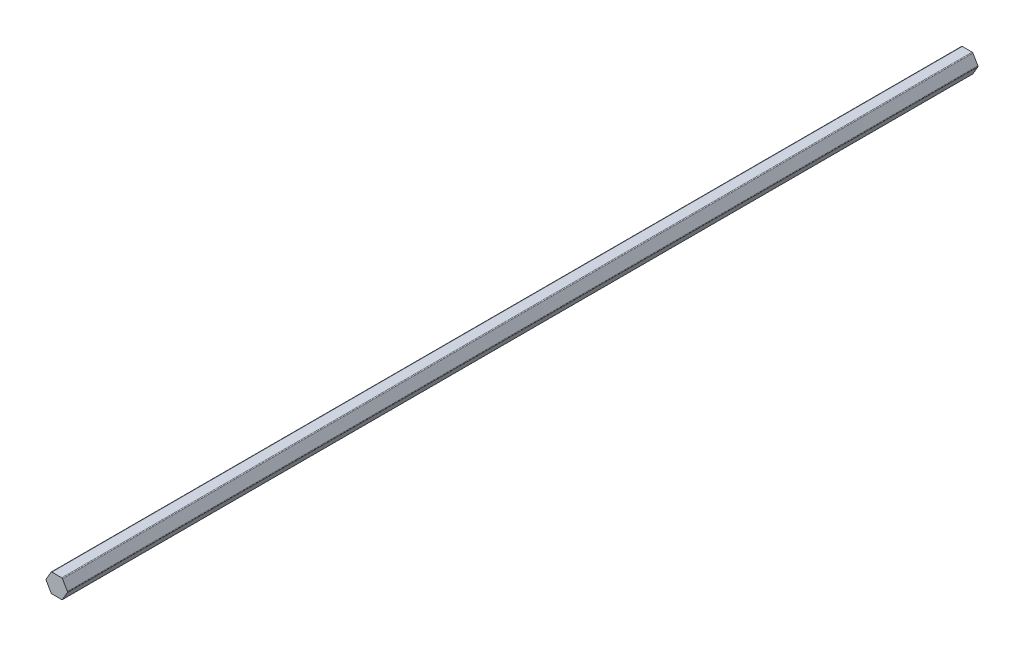
ISO-10303-21;
HEADER;
FILE_DESCRIPTION(('STEP AP214'),'2;1');
FILE_NAME('part.step','',(''),(''),'','','');
FILE_SCHEMA(('AUTOMOTIVE_DESIGN { 1 0 10303 214 1 1 1 1 }'));
ENDSEC;
DATA;
#1=APPLICATION_CONTEXT('core data for automotive mechanical design processes');
#2=APPLICATION_PROTOCOL_DEFINITION('international standard','automotive_design',2000,#1);
#3=PRODUCT_CONTEXT('',#1,'mechanical');
#4=PRODUCT('Part','Part','',(#3));
#5=PRODUCT_RELATED_PRODUCT_CATEGORY('part','',(#4));
#6=PRODUCT_DEFINITION_FORMATION('','',#4);
#7=PRODUCT_DEFINITION_CONTEXT('part definition',#1,'design');
#8=PRODUCT_DEFINITION('design','',#6,#7);
#9=PRODUCT_DEFINITION_SHAPE('','',#8);
#10=(LENGTH_UNIT() NAMED_UNIT(*) SI_UNIT(.MILLI.,.METRE.));
#11=(NAMED_UNIT(*) PLANE_ANGLE_UNIT() SI_UNIT($,.RADIAN.));
#12=(NAMED_UNIT(*) SI_UNIT($,.STERADIAN.) SOLID_ANGLE_UNIT());
#13=UNCERTAINTY_MEASURE_WITH_UNIT(LENGTH_MEASURE(1.E-05),#10,'distance_accuracy_value','');
#14=(GEOMETRIC_REPRESENTATION_CONTEXT(3) GLOBAL_UNCERTAINTY_ASSIGNED_CONTEXT((#13)) GLOBAL_UNIT_ASSIGNED_CONTEXT((#10,
#11,#12)) REPRESENTATION_CONTEXT('',''));
#15=CARTESIAN_POINT('',(0.,0.,0.));
#16=DIRECTION('',(0.,0.,1.));
#17=DIRECTION('',(1.,0.,0.));
#18=AXIS2_PLACEMENT_3D('',#15,#16,#17);
#19=CARTESIAN_POINT('',(4.89800874369711,0.,228.6));
#20=DIRECTION('',(0.,0.,-1.));
#21=DIRECTION('',(-1.,0.,0.));
#22=AXIS2_PLACEMENT_3D('',#19,#20,#21);
#23=CYLINDRICAL_SURFACE('',#22,0.508);
#24=CARTESIAN_POINT('',(4.89800874369711,0.,-228.6));
#25=DIRECTION('',(0.,0.,-1.));
#26=DIRECTION('',(-1.,0.,0.));
#27=AXIS2_PLACEMENT_3D('',#24,#25,#26);
#28=CIRCLE('',#27,0.508);
#29=CARTESIAN_POINT('',(5.3379496488196,-0.253999999999998,-228.6));
#30=VERTEX_POINT('',#29);
#31=CARTESIAN_POINT('',(5.3379496488196,0.254000000000002,-228.6));
#32=VERTEX_POINT('',#31);
#33=EDGE_CURVE('E112',#30,#32,#28,.F.);
#34=ORIENTED_EDGE('',*,*,#33,.T.);
#35=DIRECTION('',(0.,0.,1.));
#36=VECTOR('',#35,1.);
#37=CARTESIAN_POINT('',(5.3379496488196,0.254000000000002,228.6));
#38=LINE('',#37,#36);
#39=CARTESIAN_POINT('',(5.3379496488196,0.254000000000002,228.6));
#40=VERTEX_POINT('',#39);
#41=EDGE_CURVE('E110',#32,#40,#38,.T.);
#42=ORIENTED_EDGE('',*,*,#41,.T.);
#43=CARTESIAN_POINT('',(4.89800874369711,0.,228.6));
#44=DIRECTION('',(0.,0.,-1.));
#45=DIRECTION('',(-1.,0.,0.));
#46=AXIS2_PLACEMENT_3D('',#43,#44,#45);
#47=CIRCLE('',#46,0.508);
#48=CARTESIAN_POINT('',(5.3379496488196,-0.253999999999998,228.6));
#49=VERTEX_POINT('',#48);
#50=EDGE_CURVE('E20',#40,#49,#47,.T.);
#51=ORIENTED_EDGE('',*,*,#50,.T.);
#52=DIRECTION('',(0.,0.,1.));
#53=VECTOR('',#52,1.);
#54=CARTESIAN_POINT('',(5.3379496488196,-0.253999999999998,228.6));
#55=LINE('',#54,#53);
#56=EDGE_CURVE('E107',#49,#30,#55,.F.);
#57=ORIENTED_EDGE('',*,*,#56,.T.);
#58=EDGE_LOOP('',(#34,#42,#51,#57));
#59=FACE_BOUND('',#58,.T.);
#60=ADVANCED_FACE('F17',(#59),#23,.T.);
#61=CARTESIAN_POINT('',(-4.89800874369711,0.,228.6));
#62=DIRECTION('',(0.,0.,-1.));
#63=DIRECTION('',(-1.,0.,0.));
#64=AXIS2_PLACEMENT_3D('',#61,#62,#63);
#65=CYLINDRICAL_SURFACE('',#64,0.508);
#66=CARTESIAN_POINT('',(-4.89800874369711,0.,-228.6));
#67=DIRECTION('',(0.,0.,-1.));
#68=DIRECTION('',(-1.,0.,0.));
#69=AXIS2_PLACEMENT_3D('',#66,#67,#68);
#70=CIRCLE('',#69,0.508);
#71=CARTESIAN_POINT('',(-5.3379496488196,0.253999999999998,-228.6));
#72=VERTEX_POINT('',#71);
#73=CARTESIAN_POINT('',(-5.3379496488196,-0.254000000000003,-228.6));
#74=VERTEX_POINT('',#73);
#75=EDGE_CURVE('E177',#72,#74,#70,.F.);
#76=ORIENTED_EDGE('',*,*,#75,.T.);
#77=DIRECTION('',(0.,0.,1.));
#78=VECTOR('',#77,1.);
#79=CARTESIAN_POINT('',(-5.3379496488196,-0.254000000000003,228.6));
#80=LINE('',#79,#78);
#81=CARTESIAN_POINT('',(-5.3379496488196,-0.254000000000003,228.6));
#82=VERTEX_POINT('',#81);
#83=EDGE_CURVE('E147',#74,#82,#80,.T.);
#84=ORIENTED_EDGE('',*,*,#83,.T.);
#85=CARTESIAN_POINT('',(-4.89800874369711,0.,228.6));
#86=DIRECTION('',(0.,0.,-1.));
#87=DIRECTION('',(-1.,0.,0.));
#88=AXIS2_PLACEMENT_3D('',#85,#86,#87);
#89=CIRCLE('',#88,0.508);
#90=CARTESIAN_POINT('',(-5.3379496488196,0.253999999999998,228.6));
#91=VERTEX_POINT('',#90);
#92=EDGE_CURVE('E179',#82,#91,#89,.T.);
#93=ORIENTED_EDGE('',*,*,#92,.T.);
#94=DIRECTION('',(0.,0.,1.));
#95=VECTOR('',#94,1.);
#96=CARTESIAN_POINT('',(-5.3379496488196,0.253999999999999,228.6));
#97=LINE('',#96,#95);
#98=EDGE_CURVE('E150',#91,#72,#97,.F.);
#99=ORIENTED_EDGE('',*,*,#98,.T.);
#100=EDGE_LOOP('',(#76,#84,#93,#99));
#101=FACE_BOUND('',#100,.T.);
#102=ADVANCED_FACE('F317',(#101),#65,.T.);
#103=CARTESIAN_POINT('',(2.44900437184855,-4.2418,228.6));
#104=DIRECTION('',(0.,0.,-1.));
#105=DIRECTION('',(-1.,0.,0.));
#106=AXIS2_PLACEMENT_3D('',#103,#104,#105);
#107=CYLINDRICAL_SURFACE('',#106,0.508);
#108=CARTESIAN_POINT('',(2.44900437184855,-4.2418,-228.6));
#109=DIRECTION('',(0.,0.,-1.));
#110=DIRECTION('',(-1.,0.,0.));
#111=AXIS2_PLACEMENT_3D('',#108,#109,#110);
#112=CIRCLE('',#111,0.508);
#113=CARTESIAN_POINT('',(2.44900437184855,-4.7498,-228.6));
#114=VERTEX_POINT('',#113);
#115=CARTESIAN_POINT('',(2.88894527697105,-4.4958,-228.6));
#116=VERTEX_POINT('',#115);
#117=EDGE_CURVE('E174',#114,#116,#112,.F.);
#118=ORIENTED_EDGE('',*,*,#117,.T.);
#119=DIRECTION('',(0.,0.,1.));
#120=VECTOR('',#119,1.);
#121=CARTESIAN_POINT('',(2.88894527697105,-4.4958,228.6));
#122=LINE('',#121,#120);
#123=CARTESIAN_POINT('',(2.88894527697105,-4.4958,228.6));
#124=VERTEX_POINT('',#123);
#125=EDGE_CURVE('E120',#116,#124,#122,.T.);
#126=ORIENTED_EDGE('',*,*,#125,.T.);
#127=CARTESIAN_POINT('',(2.44900437184855,-4.2418,228.6));
#128=DIRECTION('',(0.,0.,-1.));
#129=DIRECTION('',(-1.,0.,0.));
#130=AXIS2_PLACEMENT_3D('',#127,#128,#129);
#131=CIRCLE('',#130,0.508);
#132=CARTESIAN_POINT('',(2.44900437184855,-4.7498,228.6));
#133=VERTEX_POINT('',#132);
#134=EDGE_CURVE('E126',#124,#133,#131,.T.);
#135=ORIENTED_EDGE('',*,*,#134,.T.);
#136=DIRECTION('',(0.,0.,1.));
#137=VECTOR('',#136,1.);
#138=CARTESIAN_POINT('',(2.44900437184855,-4.7498,228.6));
#139=LINE('',#138,#137);
#140=EDGE_CURVE('E143',#133,#114,#139,.F.);
#141=ORIENTED_EDGE('',*,*,#140,.T.);
#142=EDGE_LOOP('',(#118,#126,#135,#141));
#143=FACE_BOUND('',#142,.T.);
#144=ADVANCED_FACE('F308',(#143),#107,.T.);
#145=CARTESIAN_POINT('',(-2.44900437184855,-4.2418,228.6));
#146=DIRECTION('',(0.,0.,-1.));
#147=DIRECTION('',(-1.,0.,0.));
#148=AXIS2_PLACEMENT_3D('',#145,#146,#147);
#149=CYLINDRICAL_SURFACE('',#148,0.508);
#150=CARTESIAN_POINT('',(-2.44900437184855,-4.2418,-228.6));
#151=DIRECTION('',(0.,0.,-1.));
#152=DIRECTION('',(-1.,0.,0.));
#153=AXIS2_PLACEMENT_3D('',#150,#151,#152);
#154=CIRCLE('',#153,0.508);
#155=CARTESIAN_POINT('',(-2.88894527697105,-4.4958,-228.6));
#156=VERTEX_POINT('',#155);
#157=CARTESIAN_POINT('',(-2.44900437184855,-4.7498,-228.6));
#158=VERTEX_POINT('',#157);
#159=EDGE_CURVE('E121',#156,#158,#154,.F.);
#160=ORIENTED_EDGE('',*,*,#159,.T.);
#161=DIRECTION('',(0.,0.,1.));
#162=VECTOR('',#161,1.);
#163=CARTESIAN_POINT('',(-2.44900437184855,-4.7498,228.6));
#164=LINE('',#163,#162);
#165=CARTESIAN_POINT('',(-2.44900437184855,-4.7498,228.6));
#166=VERTEX_POINT('',#165);
#167=EDGE_CURVE('E140',#158,#166,#164,.T.);
#168=ORIENTED_EDGE('',*,*,#167,.T.);
#169=CARTESIAN_POINT('',(-2.44900437184855,-4.2418,228.6));
#170=DIRECTION('',(0.,0.,-1.));
#171=DIRECTION('',(-1.,0.,0.));
#172=AXIS2_PLACEMENT_3D('',#169,#170,#171);
#173=CIRCLE('',#172,0.508);
#174=CARTESIAN_POINT('',(-2.88894527697105,-4.4958,228.6));
#175=VERTEX_POINT('',#174);
#176=EDGE_CURVE('E172',#166,#175,#173,.T.);
#177=ORIENTED_EDGE('',*,*,#176,.T.);
#178=DIRECTION('',(0.,0.,1.));
#179=VECTOR('',#178,1.);
#180=CARTESIAN_POINT('',(-2.88894527697105,-4.4958,228.6));
#181=LINE('',#180,#179);
#182=EDGE_CURVE('E146',#175,#156,#181,.F.);
#183=ORIENTED_EDGE('',*,*,#182,.T.);
#184=EDGE_LOOP('',(#160,#168,#177,#183));
#185=FACE_BOUND('',#184,.T.);
#186=ADVANCED_FACE('F300',(#185),#149,.T.);
#187=CARTESIAN_POINT('',(2.74229830859688,-4.7498,228.6));
#188=DIRECTION('',(-0.866025403784439,0.5,0.));
#189=DIRECTION('',(-0.5,-0.866025403784439,0.));
#190=AXIS2_PLACEMENT_3D('',#187,#188,#189);
#191=PLANE('',#190);
#192=ORIENTED_EDGE('',*,*,#125,.F.);
#193=DIRECTION('',(0.5,0.866025403784439,0.));
#194=VECTOR('',#193,1.);
#195=CARTESIAN_POINT('',(2.88894527697105,-4.4958,-228.6));
#196=LINE('',#195,#194);
#197=EDGE_CURVE('E119',#116,#30,#196,.T.);
#198=ORIENTED_EDGE('',*,*,#197,.T.);
#199=ORIENTED_EDGE('',*,*,#56,.F.);
#200=DIRECTION('',(0.5,0.866025403784439,0.));
#201=VECTOR('',#200,1.);
#202=CARTESIAN_POINT('',(2.88894527697105,-4.4958,228.6));
#203=LINE('',#202,#201);
#204=EDGE_CURVE('E117',#124,#49,#203,.T.);
#205=ORIENTED_EDGE('',*,*,#204,.F.);
#206=EDGE_LOOP('',(#192,#198,#199,#205));
#207=FACE_BOUND('',#206,.T.);
#208=ADVANCED_FACE('F116',(#207),#191,.F.);
#209=CARTESIAN_POINT('',(5.48459661719377,0.,228.6));
#210=DIRECTION('',(-0.866025403784439,-0.5,0.));
#211=DIRECTION('',(0.5,-0.866025403784439,0.));
#212=AXIS2_PLACEMENT_3D('',#209,#210,#211);
#213=PLANE('',#212);
#214=ORIENTED_EDGE('',*,*,#41,.F.);
#215=DIRECTION('',(-0.5,0.866025403784438,0.));
#216=VECTOR('',#215,1.);
#217=CARTESIAN_POINT('',(5.3379496488196,0.254000000000003,-228.6));
#218=LINE('',#217,#216);
#219=CARTESIAN_POINT('',(2.88894527697105,4.4958,-228.6));
#220=VERTEX_POINT('',#219);
#221=EDGE_CURVE('E167',#32,#220,#218,.T.);
#222=ORIENTED_EDGE('',*,*,#221,.T.);
#223=DIRECTION('',(0.,0.,-1.));
#224=VECTOR('',#223,1.);
#225=CARTESIAN_POINT('',(2.88894527697105,4.4958,228.6));
#226=LINE('',#225,#224);
#227=CARTESIAN_POINT('',(2.88894527697105,4.4958,228.6));
#228=VERTEX_POINT('',#227);
#229=EDGE_CURVE('E139',#228,#220,#226,.T.);
#230=ORIENTED_EDGE('',*,*,#229,.F.);
#231=DIRECTION('',(-0.5,0.866025403784438,0.));
#232=VECTOR('',#231,1.);
#233=CARTESIAN_POINT('',(5.3379496488196,0.254000000000003,228.6));
#234=LINE('',#233,#232);
#235=EDGE_CURVE('E128',#40,#228,#234,.T.);
#236=ORIENTED_EDGE('',*,*,#235,.F.);
#237=EDGE_LOOP('',(#214,#222,#230,#236));
#238=FACE_BOUND('',#237,.T.);
#239=ADVANCED_FACE('F183',(#238),#213,.F.);
#240=CARTESIAN_POINT('',(-2.74229830859689,4.7498,228.6));
#241=DIRECTION('',(0.866025403784439,-0.5,0.));
#242=DIRECTION('',(0.5,0.866025403784439,0.));
#243=AXIS2_PLACEMENT_3D('',#240,#241,#242);
#244=PLANE('',#243);
#245=DIRECTION('',(0.,0.,-1.));
#246=VECTOR('',#245,1.);
#247=CARTESIAN_POINT('',(-2.88894527697105,4.4958,228.6));
#248=LINE('',#247,#246);
#249=CARTESIAN_POINT('',(-2.88894527697105,4.4958,-228.6));
#250=VERTEX_POINT('',#249);
#251=CARTESIAN_POINT('',(-2.88894527697105,4.4958,228.6));
#252=VERTEX_POINT('',#251);
#253=EDGE_CURVE('E155',#250,#252,#248,.F.);
#254=ORIENTED_EDGE('',*,*,#253,.F.);
#255=DIRECTION('',(-0.499999999999999,-0.866025403784439,0.));
#256=VECTOR('',#255,1.);
#257=CARTESIAN_POINT('',(-2.88894527697105,4.4958,-228.6));
#258=LINE('',#257,#256);
#259=EDGE_CURVE('E163',#250,#72,#258,.T.);
#260=ORIENTED_EDGE('',*,*,#259,.T.);
#261=ORIENTED_EDGE('',*,*,#98,.F.);
#262=DIRECTION('',(-0.499999999999999,-0.866025403784439,0.));
#263=VECTOR('',#262,1.);
#264=CARTESIAN_POINT('',(-2.88894527697105,4.4958,228.6));
#265=LINE('',#264,#263);
#266=EDGE_CURVE('E169',#252,#91,#265,.T.);
#267=ORIENTED_EDGE('',*,*,#266,.F.);
#268=EDGE_LOOP('',(#254,#260,#261,#267));
#269=FACE_BOUND('',#268,.T.);
#270=ADVANCED_FACE('F203',(#269),#244,.F.);
#271=CARTESIAN_POINT('',(-5.48459661719377,0.,228.6));
#272=DIRECTION('',(0.866025403784438,0.500000000000001,0.));
#273=DIRECTION('',(-0.500000000000001,0.866025403784438,0.));
#274=AXIS2_PLACEMENT_3D('',#271,#272,#273);
#275=PLANE('',#274);
#276=ORIENTED_EDGE('',*,*,#182,.F.);
#277=DIRECTION('',(0.500000000000001,-0.866025403784438,0.));
#278=VECTOR('',#277,1.);
#279=CARTESIAN_POINT('',(-5.3379496488196,-0.254000000000003,228.6));
#280=LINE('',#279,#278);
#281=EDGE_CURVE('E133',#82,#175,#280,.T.);
#282=ORIENTED_EDGE('',*,*,#281,.F.);
#283=ORIENTED_EDGE('',*,*,#83,.F.);
#284=DIRECTION('',(0.500000000000001,-0.866025403784438,0.));
#285=VECTOR('',#284,1.);
#286=CARTESIAN_POINT('',(-5.3379496488196,-0.254000000000003,-228.6));
#287=LINE('',#286,#285);
#288=EDGE_CURVE('E350',#74,#156,#287,.T.);
#289=ORIENTED_EDGE('',*,*,#288,.T.);
#290=EDGE_LOOP('',(#276,#282,#283,#289));
#291=FACE_BOUND('',#290,.T.);
#292=ADVANCED_FACE('F223',(#291),#275,.F.);
#293=CARTESIAN_POINT('',(-2.74229830859688,-4.7498,228.6));
#294=DIRECTION('',(0.,1.,0.));
#295=DIRECTION('',(-1.,0.,0.));
#296=AXIS2_PLACEMENT_3D('',#293,#294,#295);
#297=PLANE('',#296);
#298=ORIENTED_EDGE('',*,*,#167,.F.);
#299=DIRECTION('',(1.,0.,0.));
#300=VECTOR('',#299,1.);
#301=CARTESIAN_POINT('',(2.74229830859688,-4.7498,-228.6));
#302=LINE('',#301,#300);
#303=EDGE_CURVE('E198',#158,#114,#302,.T.);
#304=ORIENTED_EDGE('',*,*,#303,.T.);
#305=ORIENTED_EDGE('',*,*,#140,.F.);
#306=DIRECTION('',(1.,0.,0.));
#307=VECTOR('',#306,1.);
#308=CARTESIAN_POINT('',(2.74229830859688,-4.7498,228.6));
#309=LINE('',#308,#307);
#310=EDGE_CURVE('E129',#166,#133,#309,.T.);
#311=ORIENTED_EDGE('',*,*,#310,.F.);
#312=EDGE_LOOP('',(#298,#304,#305,#311));
#313=FACE_BOUND('',#312,.T.);
#314=ADVANCED_FACE('F215',(#313),#297,.F.);
#315=CARTESIAN_POINT('',(2.44900437184856,4.2418,228.6));
#316=DIRECTION('',(0.,0.,-1.));
#317=DIRECTION('',(-1.,0.,0.));
#318=AXIS2_PLACEMENT_3D('',#315,#316,#317);
#319=CYLINDRICAL_SURFACE('',#318,0.508);
#320=CARTESIAN_POINT('',(2.44900437184856,4.2418,-228.6));
#321=DIRECTION('',(0.,0.,-1.));
#322=DIRECTION('',(-1.,0.,0.));
#323=AXIS2_PLACEMENT_3D('',#320,#321,#322);
#324=CIRCLE('',#323,0.508);
#325=CARTESIAN_POINT('',(2.44900437184856,4.7498,-228.6));
#326=VERTEX_POINT('',#325);
#327=EDGE_CURVE('E164',#220,#326,#324,.F.);
#328=ORIENTED_EDGE('',*,*,#327,.T.);
#329=DIRECTION('',(0.,0.,-1.));
#330=VECTOR('',#329,1.);
#331=CARTESIAN_POINT('',(2.44900437184856,4.7498,228.6));
#332=LINE('',#331,#330);
#333=CARTESIAN_POINT('',(2.44900437184856,4.7498,228.6));
#334=VERTEX_POINT('',#333);
#335=EDGE_CURVE('E195',#326,#334,#332,.F.);
#336=ORIENTED_EDGE('',*,*,#335,.T.);
#337=CARTESIAN_POINT('',(2.44900437184856,4.2418,228.6));
#338=DIRECTION('',(0.,0.,-1.));
#339=DIRECTION('',(-1.,0.,0.));
#340=AXIS2_PLACEMENT_3D('',#337,#338,#339);
#341=CIRCLE('',#340,0.508);
#342=EDGE_CURVE('E131',#228,#334,#341,.F.);
#343=ORIENTED_EDGE('',*,*,#342,.F.);
#344=ORIENTED_EDGE('',*,*,#229,.T.);
#345=EDGE_LOOP('',(#328,#336,#343,#344));
#346=FACE_BOUND('',#345,.T.);
#347=ADVANCED_FACE('F213',(#346),#319,.T.);
#348=CARTESIAN_POINT('',(2.74229830859688,4.7498,228.6));
#349=DIRECTION('',(0.,0.,1.));
#350=DIRECTION('',(1.,0.,0.));
#351=AXIS2_PLACEMENT_3D('',#348,#349,#350);
#352=PLANE('',#351);
#353=ORIENTED_EDGE('',*,*,#266,.T.);
#354=ORIENTED_EDGE('',*,*,#92,.F.);
#355=ORIENTED_EDGE('',*,*,#281,.T.);
#356=ORIENTED_EDGE('',*,*,#176,.F.);
#357=ORIENTED_EDGE('',*,*,#310,.T.);
#358=ORIENTED_EDGE('',*,*,#134,.F.);
#359=ORIENTED_EDGE('',*,*,#204,.T.);
#360=ORIENTED_EDGE('',*,*,#50,.F.);
#361=ORIENTED_EDGE('',*,*,#235,.T.);
#362=ORIENTED_EDGE('',*,*,#342,.T.);
#363=DIRECTION('',(1.,0.,0.));
#364=VECTOR('',#363,1.);
#365=CARTESIAN_POINT('',(2.74229830859688,4.7498,228.6));
#366=LINE('',#365,#364);
#367=CARTESIAN_POINT('',(-2.44900437184856,4.7498,228.6));
#368=VERTEX_POINT('',#367);
#369=EDGE_CURVE('E193',#334,#368,#366,.F.);
#370=ORIENTED_EDGE('',*,*,#369,.T.);
#371=CARTESIAN_POINT('',(-2.44900437184856,4.2418,228.6));
#372=DIRECTION('',(0.,0.,-1.));
#373=DIRECTION('',(-1.,0.,0.));
#374=AXIS2_PLACEMENT_3D('',#371,#372,#373);
#375=CIRCLE('',#374,0.508);
#376=EDGE_CURVE('E158',#252,#368,#375,.T.);
#377=ORIENTED_EDGE('',*,*,#376,.F.);
#378=EDGE_LOOP('',(#353,#354,#355,#356,#357,#358,#359,#360,#361,#362,#370,#377));
#379=FACE_BOUND('',#378,.T.);
#380=ADVANCED_FACE('F124',(#379),#352,.T.);
#381=CARTESIAN_POINT('',(-2.44900437184856,4.2418,228.6));
#382=DIRECTION('',(0.,0.,-1.));
#383=DIRECTION('',(-1.,0.,0.));
#384=AXIS2_PLACEMENT_3D('',#381,#382,#383);
#385=CYLINDRICAL_SURFACE('',#384,0.508);
#386=CARTESIAN_POINT('',(-2.44900437184856,4.2418,-228.6));
#387=DIRECTION('',(0.,0.,-1.));
#388=DIRECTION('',(-1.,0.,0.));
#389=AXIS2_PLACEMENT_3D('',#386,#387,#388);
#390=CIRCLE('',#389,0.508);
#391=CARTESIAN_POINT('',(-2.44900437184856,4.7498,-228.6));
#392=VERTEX_POINT('',#391);
#393=EDGE_CURVE('E34',#392,#250,#390,.F.);
#394=ORIENTED_EDGE('',*,*,#393,.T.);
#395=ORIENTED_EDGE('',*,*,#253,.T.);
#396=ORIENTED_EDGE('',*,*,#376,.T.);
#397=DIRECTION('',(0.,0.,-1.));
#398=VECTOR('',#397,1.);
#399=CARTESIAN_POINT('',(-2.44900437184856,4.7498,228.6));
#400=LINE('',#399,#398);
#401=EDGE_CURVE('E26',#368,#392,#400,.T.);
#402=ORIENTED_EDGE('',*,*,#401,.T.);
#403=EDGE_LOOP('',(#394,#395,#396,#402));
#404=FACE_BOUND('',#403,.T.);
#405=ADVANCED_FACE('F206',(#404),#385,.T.);
#406=CARTESIAN_POINT('',(2.74229830859688,4.7498,-228.6));
#407=DIRECTION('',(0.,0.,1.));
#408=DIRECTION('',(1.,0.,0.));
#409=AXIS2_PLACEMENT_3D('',#406,#407,#408);
#410=PLANE('',#409);
#411=ORIENTED_EDGE('',*,*,#159,.F.);
#412=ORIENTED_EDGE('',*,*,#288,.F.);
#413=ORIENTED_EDGE('',*,*,#75,.F.);
#414=ORIENTED_EDGE('',*,*,#259,.F.);
#415=ORIENTED_EDGE('',*,*,#393,.F.);
#416=DIRECTION('',(1.,0.,0.));
#417=VECTOR('',#416,1.);
#418=CARTESIAN_POINT('',(2.74229830859688,4.7498,-228.6));
#419=LINE('',#418,#417);
#420=EDGE_CURVE('E10',#392,#326,#419,.T.);
#421=ORIENTED_EDGE('',*,*,#420,.T.);
#422=ORIENTED_EDGE('',*,*,#327,.F.);
#423=ORIENTED_EDGE('',*,*,#221,.F.);
#424=ORIENTED_EDGE('',*,*,#33,.F.);
#425=ORIENTED_EDGE('',*,*,#197,.F.);
#426=ORIENTED_EDGE('',*,*,#117,.F.);
#427=ORIENTED_EDGE('',*,*,#303,.F.);
#428=EDGE_LOOP('',(#411,#412,#413,#414,#415,#421,#422,#423,#424,#425,#426,#427));
#429=FACE_BOUND('',#428,.T.);
#430=ADVANCED_FACE('F186',(#429),#410,.F.);
#431=CARTESIAN_POINT('',(2.74229830859688,4.7498,228.6));
#432=DIRECTION('',(0.,-1.,0.));
#433=DIRECTION('',(0.,0.,-1.));
#434=AXIS2_PLACEMENT_3D('',#431,#432,#433);
#435=PLANE('',#434);
#436=ORIENTED_EDGE('',*,*,#401,.F.);
#437=ORIENTED_EDGE('',*,*,#369,.F.);
#438=ORIENTED_EDGE('',*,*,#335,.F.);
#439=ORIENTED_EDGE('',*,*,#420,.F.);
#440=EDGE_LOOP('',(#436,#437,#438,#439));
#441=FACE_BOUND('',#440,.T.);
#442=ADVANCED_FACE('F210',(#441),#435,.F.);
#443=CLOSED_SHELL('',(#60,#102,#144,#186,#208,#239,#270,#292,#314,#347,#380,#405,#430,#442));
#444=MANIFOLD_SOLID_BREP('B1',#443);
#445=ADVANCED_BREP_SHAPE_REPRESENTATION('',(#18,#444),#14);
#446=SHAPE_DEFINITION_REPRESENTATION(#9,#445);
ENDSEC;
END-ISO-10303-21;
